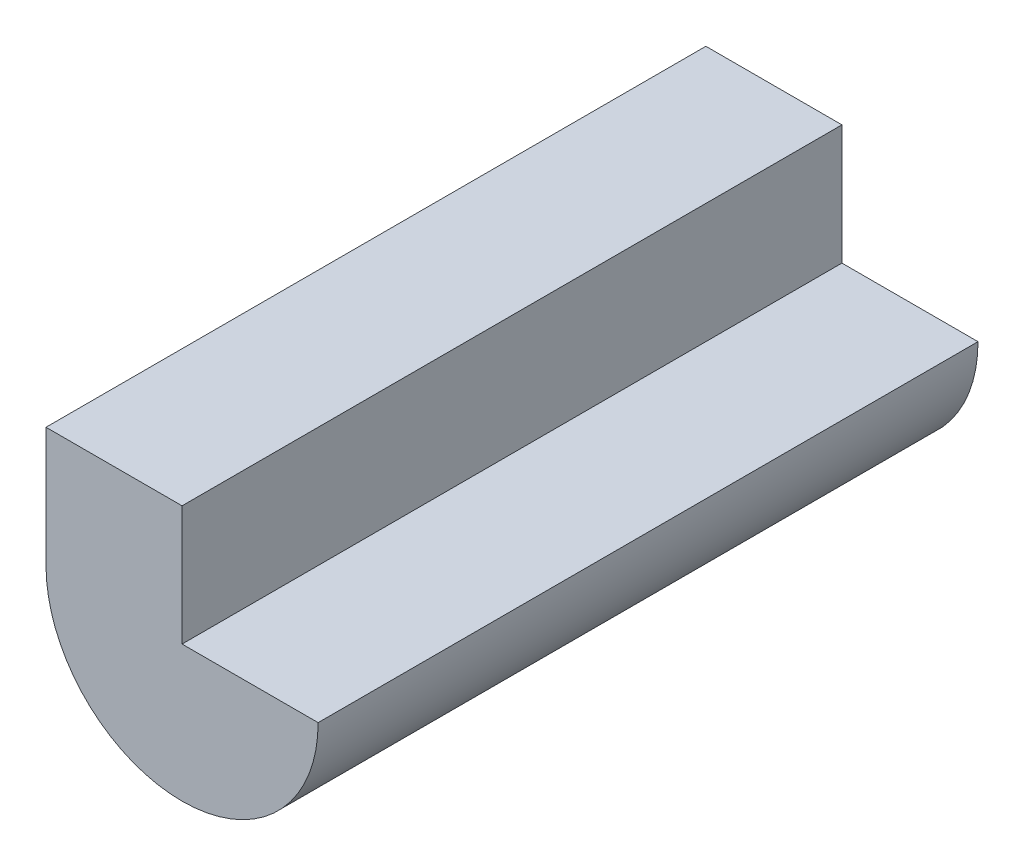
ISO-10303-21;
HEADER;
FILE_DESCRIPTION(('STEP AP214'),'2;1');
FILE_NAME('part.step','',(''),(''),'','','');
FILE_SCHEMA(('AUTOMOTIVE_DESIGN { 1 0 10303 214 1 1 1 1 }'));
ENDSEC;
DATA;
#1=APPLICATION_CONTEXT('core data for automotive mechanical design processes');
#2=APPLICATION_PROTOCOL_DEFINITION('international standard','automotive_design',2000,#1);
#3=PRODUCT_CONTEXT('',#1,'mechanical');
#4=PRODUCT('Part','Part','',(#3));
#5=PRODUCT_RELATED_PRODUCT_CATEGORY('part','',(#4));
#6=PRODUCT_DEFINITION_FORMATION('','',#4);
#7=PRODUCT_DEFINITION_CONTEXT('part definition',#1,'design');
#8=PRODUCT_DEFINITION('design','',#6,#7);
#9=PRODUCT_DEFINITION_SHAPE('','',#8);
#10=(LENGTH_UNIT() NAMED_UNIT(*) SI_UNIT(.MILLI.,.METRE.));
#11=(NAMED_UNIT(*) PLANE_ANGLE_UNIT() SI_UNIT($,.RADIAN.));
#12=(NAMED_UNIT(*) SI_UNIT($,.STERADIAN.) SOLID_ANGLE_UNIT());
#13=UNCERTAINTY_MEASURE_WITH_UNIT(LENGTH_MEASURE(1.E-05),#10,'distance_accuracy_value','');
#14=(GEOMETRIC_REPRESENTATION_CONTEXT(3) GLOBAL_UNCERTAINTY_ASSIGNED_CONTEXT((#13)) GLOBAL_UNIT_ASSIGNED_CONTEXT((#10,
#11,#12)) REPRESENTATION_CONTEXT('',''));
#15=CARTESIAN_POINT('',(0.,0.,0.));
#16=DIRECTION('',(0.,0.,1.));
#17=DIRECTION('',(1.,0.,0.));
#18=AXIS2_PLACEMENT_3D('',#15,#16,#17);
#19=CARTESIAN_POINT('',(-25.9741611328456,-35.,-43.6425632628506));
#20=DIRECTION('',(0.,-1.,0.));
#21=DIRECTION('',(0.,0.,-1.));
#22=AXIS2_PLACEMENT_3D('',#19,#20,#21);
#23=PLANE('',#22);
#24=DIRECTION('',(-1.,0.,0.));
#25=VECTOR('',#24,1.);
#26=CARTESIAN_POINT('',(14.8423342918002,-35.,-7.03853359073944));
#27=LINE('',#26,#25);
#28=CARTESIAN_POINT('',(17.3423342918002,-35.,-7.03853359073944));
#29=VERTEX_POINT('',#28);
#30=CARTESIAN_POINT('',(14.8423342918002,-35.,-7.03853359073944));
#31=VERTEX_POINT('',#30);
#32=EDGE_CURVE('E110',#29,#31,#27,.T.);
#33=ORIENTED_EDGE('',*,*,#32,.F.);
#34=DIRECTION('',(0.,0.,1.));
#35=VECTOR('',#34,1.);
#36=CARTESIAN_POINT('',(17.3423342918002,-35.,-19.1624239089916));
#37=LINE('',#36,#35);
#38=CARTESIAN_POINT('',(17.3423342918002,-35.,-19.1624239089916));
#39=VERTEX_POINT('',#38);
#40=EDGE_CURVE('E114',#39,#29,#37,.T.);
#41=ORIENTED_EDGE('',*,*,#40,.F.);
#42=DIRECTION('',(1.,0.,0.));
#43=VECTOR('',#42,1.);
#44=CARTESIAN_POINT('',(14.8423342918002,-35.,-19.1624239089916));
#45=LINE('',#44,#43);
#46=CARTESIAN_POINT('',(14.8423342918002,-35.,-19.1624239089916));
#47=VERTEX_POINT('',#46);
#48=EDGE_CURVE('E53',#47,#39,#45,.T.);
#49=ORIENTED_EDGE('',*,*,#48,.F.);
#50=DIRECTION('',(0.,0.,-1.));
#51=VECTOR('',#50,1.);
#52=CARTESIAN_POINT('',(14.8423342918002,-35.,-19.1624239089916));
#53=LINE('',#52,#51);
#54=EDGE_CURVE('E47',#31,#47,#53,.T.);
#55=ORIENTED_EDGE('',*,*,#54,.F.);
#56=EDGE_LOOP('',(#33,#41,#49,#55));
#57=FACE_BOUND('',#56,.T.);
#58=ADVANCED_FACE('F33',(#57),#23,.F.);
#59=CARTESIAN_POINT('',(14.8423342918002,-37.2,-19.1624239089916));
#60=DIRECTION('',(0.,0.,1.));
#61=DIRECTION('',(1.,0.,0.));
#62=AXIS2_PLACEMENT_3D('',#59,#60,#61);
#63=PLANE('',#62);
#64=ORIENTED_EDGE('',*,*,#48,.T.);
#65=DIRECTION('',(0.,1.,0.));
#66=VECTOR('',#65,1.);
#67=CARTESIAN_POINT('',(17.3423342918002,-37.2,-19.1624239089916));
#68=LINE('',#67,#66);
#69=CARTESIAN_POINT('',(17.3423342918002,-37.2,-19.1624239089916));
#70=VERTEX_POINT('',#69);
#71=EDGE_CURVE('E40',#70,#39,#68,.T.);
#72=ORIENTED_EDGE('',*,*,#71,.F.);
#73=DIRECTION('',(-1.,0.,0.));
#74=VECTOR('',#73,1.);
#75=CARTESIAN_POINT('',(19.8423342918002,-37.2,-19.1624239089916));
#76=LINE('',#75,#74);
#77=CARTESIAN_POINT('',(19.8423342918002,-37.2,-19.1624239089916));
#78=VERTEX_POINT('',#77);
#79=EDGE_CURVE('E103',#78,#70,#76,.T.);
#80=ORIENTED_EDGE('',*,*,#79,.F.);
#81=CARTESIAN_POINT('',(17.3423342918002,-37.2,-19.1624239089916));
#82=DIRECTION('',(0.,0.,-1.));
#83=DIRECTION('',(-1.,0.,0.));
#84=AXIS2_PLACEMENT_3D('',#81,#82,#83);
#85=CIRCLE('',#84,2.5);
#86=CARTESIAN_POINT('',(14.8423342918002,-37.2,-19.1624239089916));
#87=VERTEX_POINT('',#86);
#88=EDGE_CURVE('E99',#78,#87,#85,.T.);
#89=ORIENTED_EDGE('',*,*,#88,.T.);
#90=DIRECTION('',(0.,1.,0.));
#91=VECTOR('',#90,1.);
#92=CARTESIAN_POINT('',(14.8423342918002,-37.2,-19.1624239089916));
#93=LINE('',#92,#91);
#94=EDGE_CURVE('E11',#87,#47,#93,.T.);
#95=ORIENTED_EDGE('',*,*,#94,.T.);
#96=EDGE_LOOP('',(#64,#72,#80,#89,#95));
#97=FACE_BOUND('',#96,.T.);
#98=ADVANCED_FACE('F123',(#97),#63,.F.);
#99=CARTESIAN_POINT('',(17.3423342918002,-37.2,-19.1624239089916));
#100=DIRECTION('',(-1.,0.,0.));
#101=DIRECTION('',(0.,0.,1.));
#102=AXIS2_PLACEMENT_3D('',#99,#100,#101);
#103=PLANE('',#102);
#104=ORIENTED_EDGE('',*,*,#40,.T.);
#105=DIRECTION('',(0.,1.,0.));
#106=VECTOR('',#105,1.);
#107=CARTESIAN_POINT('',(17.3423342918002,-37.2,-7.03853359073944));
#108=LINE('',#107,#106);
#109=CARTESIAN_POINT('',(17.3423342918002,-37.2,-7.03853359073944));
#110=VERTEX_POINT('',#109);
#111=EDGE_CURVE('E118',#110,#29,#108,.T.);
#112=ORIENTED_EDGE('',*,*,#111,.F.);
#113=DIRECTION('',(0.,0.,1.));
#114=VECTOR('',#113,1.);
#115=CARTESIAN_POINT('',(17.3423342918002,-37.2,-19.1624239089916));
#116=LINE('',#115,#114);
#117=EDGE_CURVE('E87',#70,#110,#116,.T.);
#118=ORIENTED_EDGE('',*,*,#117,.F.);
#119=ORIENTED_EDGE('',*,*,#71,.T.);
#120=EDGE_LOOP('',(#104,#112,#118,#119));
#121=FACE_BOUND('',#120,.T.);
#122=ADVANCED_FACE('F121',(#121),#103,.F.);
#123=CARTESIAN_POINT('',(34.6846685836005,-37.1999999999999,0.));
#124=DIRECTION('',(0.,1.,0.));
#125=DIRECTION('',(0.,0.,-1.));
#126=AXIS2_PLACEMENT_3D('',#123,#124,#125);
#127=PLANE('',#126);
#128=ORIENTED_EDGE('',*,*,#117,.T.);
#129=DIRECTION('',(1.,0.,0.));
#130=VECTOR('',#129,1.);
#131=CARTESIAN_POINT('',(17.3423342918002,-37.2,-7.03853359073944));
#132=LINE('',#131,#130);
#133=CARTESIAN_POINT('',(19.8423342918002,-37.2,-7.03853359073944));
#134=VERTEX_POINT('',#133);
#135=EDGE_CURVE('E80',#110,#134,#132,.T.);
#136=ORIENTED_EDGE('',*,*,#135,.T.);
#137=DIRECTION('',(0.,0.,-1.));
#138=VECTOR('',#137,1.);
#139=CARTESIAN_POINT('',(19.8423342918002,-37.2,-7.03853359073944));
#140=LINE('',#139,#138);
#141=EDGE_CURVE('E85',#134,#78,#140,.T.);
#142=ORIENTED_EDGE('',*,*,#141,.T.);
#143=ORIENTED_EDGE('',*,*,#79,.T.);
#144=EDGE_LOOP('',(#128,#136,#142,#143));
#145=FACE_BOUND('',#144,.T.);
#146=ADVANCED_FACE('F82',(#145),#127,.T.);
#147=CARTESIAN_POINT('',(17.3423342918002,-37.2,-19.1624239089916));
#148=DIRECTION('',(0.,0.,-1.));
#149=DIRECTION('',(-1.,0.,0.));
#150=AXIS2_PLACEMENT_3D('',#147,#148,#149);
#151=CYLINDRICAL_SURFACE('',#150,2.5);
#152=ORIENTED_EDGE('',*,*,#88,.F.);
#153=ORIENTED_EDGE('',*,*,#141,.F.);
#154=CARTESIAN_POINT('',(17.3423342918002,-37.2,-7.03853359073944));
#155=DIRECTION('',(0.,0.,-1.));
#156=DIRECTION('',(-1.,0.,0.));
#157=AXIS2_PLACEMENT_3D('',#154,#155,#156);
#158=CIRCLE('',#157,2.5);
#159=CARTESIAN_POINT('',(14.8423342918002,-37.2,-7.03853359073944));
#160=VERTEX_POINT('',#159);
#161=EDGE_CURVE('E92',#134,#160,#158,.T.);
#162=ORIENTED_EDGE('',*,*,#161,.T.);
#163=DIRECTION('',(0.,0.,-1.));
#164=VECTOR('',#163,1.);
#165=CARTESIAN_POINT('',(14.8423342918002,-37.2,-19.1624239089916));
#166=LINE('',#165,#164);
#167=EDGE_CURVE('E108',#160,#87,#166,.T.);
#168=ORIENTED_EDGE('',*,*,#167,.T.);
#169=EDGE_LOOP('',(#152,#153,#162,#168));
#170=FACE_BOUND('',#169,.T.);
#171=ADVANCED_FACE('F101',(#170),#151,.T.);
#172=CARTESIAN_POINT('',(14.8423342918002,-37.2,-19.1624239089916));
#173=DIRECTION('',(1.,0.,0.));
#174=DIRECTION('',(0.,0.,-1.));
#175=AXIS2_PLACEMENT_3D('',#172,#173,#174);
#176=PLANE('',#175);
#177=ORIENTED_EDGE('',*,*,#54,.T.);
#178=ORIENTED_EDGE('',*,*,#94,.F.);
#179=ORIENTED_EDGE('',*,*,#167,.F.);
#180=DIRECTION('',(0.,1.,0.));
#181=VECTOR('',#180,1.);
#182=CARTESIAN_POINT('',(14.8423342918002,-37.2,-7.03853359073944));
#183=LINE('',#182,#181);
#184=EDGE_CURVE('E95',#160,#31,#183,.T.);
#185=ORIENTED_EDGE('',*,*,#184,.T.);
#186=EDGE_LOOP('',(#177,#178,#179,#185));
#187=FACE_BOUND('',#186,.T.);
#188=ADVANCED_FACE('F124',(#187),#176,.F.);
#189=CARTESIAN_POINT('',(14.8423342918002,-37.2,-7.03853359073944));
#190=DIRECTION('',(0.,0.,-1.));
#191=DIRECTION('',(-1.,0.,0.));
#192=AXIS2_PLACEMENT_3D('',#189,#190,#191);
#193=PLANE('',#192);
#194=ORIENTED_EDGE('',*,*,#32,.T.);
#195=ORIENTED_EDGE('',*,*,#184,.F.);
#196=ORIENTED_EDGE('',*,*,#161,.F.);
#197=ORIENTED_EDGE('',*,*,#135,.F.);
#198=ORIENTED_EDGE('',*,*,#111,.T.);
#199=EDGE_LOOP('',(#194,#195,#196,#197,#198));
#200=FACE_BOUND('',#199,.T.);
#201=ADVANCED_FACE('F94',(#200),#193,.F.);
#202=CLOSED_SHELL('',(#58,#98,#122,#146,#171,#188,#201));
#203=MANIFOLD_SOLID_BREP('B2',#202);
#204=ADVANCED_BREP_SHAPE_REPRESENTATION('',(#18,#203),#14);
#205=SHAPE_DEFINITION_REPRESENTATION(#9,#204);
ENDSEC;
END-ISO-10303-21;
